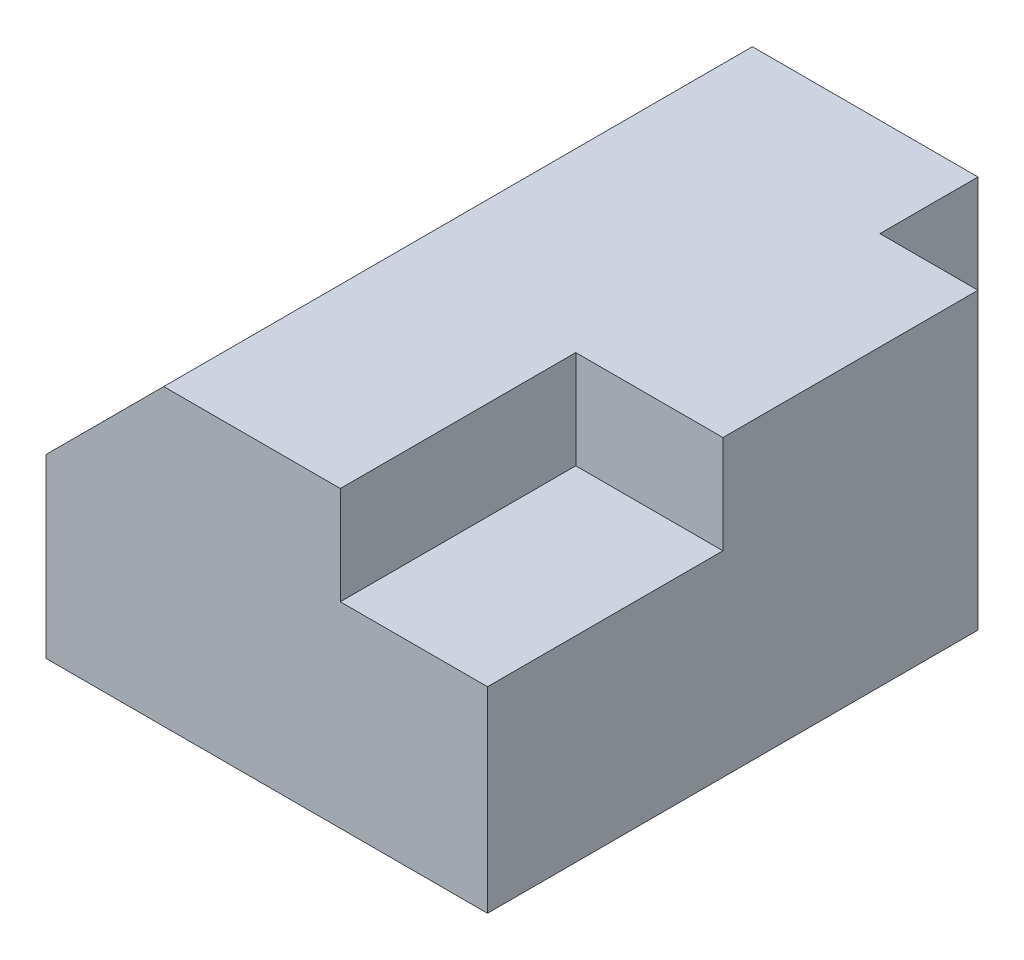
ISO-10303-21;
HEADER;
FILE_DESCRIPTION(('STEP AP214'),'2;1');
FILE_NAME('part.step','',(''),(''),'','','');
FILE_SCHEMA(('AUTOMOTIVE_DESIGN { 1 0 10303 214 1 1 1 1 }'));
ENDSEC;
DATA;
#1=APPLICATION_CONTEXT('core data for automotive mechanical design processes');
#2=APPLICATION_PROTOCOL_DEFINITION('international standard','automotive_design',2000,#1);
#3=PRODUCT_CONTEXT('',#1,'mechanical');
#4=PRODUCT('Part','Part','',(#3));
#5=PRODUCT_RELATED_PRODUCT_CATEGORY('part','',(#4));
#6=PRODUCT_DEFINITION_FORMATION('','',#4);
#7=PRODUCT_DEFINITION_CONTEXT('part definition',#1,'design');
#8=PRODUCT_DEFINITION('design','',#6,#7);
#9=PRODUCT_DEFINITION_SHAPE('','',#8);
#10=(LENGTH_UNIT() NAMED_UNIT(*) SI_UNIT(.MILLI.,.METRE.));
#11=(NAMED_UNIT(*) PLANE_ANGLE_UNIT() SI_UNIT($,.RADIAN.));
#12=(NAMED_UNIT(*) SI_UNIT($,.STERADIAN.) SOLID_ANGLE_UNIT());
#13=UNCERTAINTY_MEASURE_WITH_UNIT(LENGTH_MEASURE(1.E-05),#10,'distance_accuracy_value','');
#14=(GEOMETRIC_REPRESENTATION_CONTEXT(3) GLOBAL_UNCERTAINTY_ASSIGNED_CONTEXT((#13)) GLOBAL_UNIT_ASSIGNED_CONTEXT((#10,
#11,#12)) REPRESENTATION_CONTEXT('',''));
#15=CARTESIAN_POINT('',(0.,0.,0.));
#16=DIRECTION('',(0.,0.,1.));
#17=DIRECTION('',(1.,0.,0.));
#18=AXIS2_PLACEMENT_3D('',#15,#16,#17);
#19=CARTESIAN_POINT('',(22.9558011049724,15.6629834254144,60.));
#20=DIRECTION('',(0.,-1.,0.));
#21=DIRECTION('',(1.,0.,0.));
#22=AXIS2_PLACEMENT_3D('',#19,#20,#21);
#23=PLANE('',#22);
#24=DIRECTION('',(1.,0.,0.));
#25=VECTOR('',#24,1.);
#26=CARTESIAN_POINT('',(7.9558011049724,15.6629834254144,36.));
#27=LINE('',#26,#25);
#28=CARTESIAN_POINT('',(7.95580110497239,15.6629834254144,36.));
#29=VERTEX_POINT('',#28);
#30=CARTESIAN_POINT('',(22.9558011049724,15.6629834254144,36.));
#31=VERTEX_POINT('',#30);
#32=EDGE_CURVE('E208',#29,#31,#27,.T.);
#33=ORIENTED_EDGE('',*,*,#32,.F.);
#34=DIRECTION('',(0.,0.,-1.));
#35=VECTOR('',#34,1.);
#36=CARTESIAN_POINT('',(7.95580110497239,15.6629834254144,60.));
#37=LINE('',#36,#35);
#38=CARTESIAN_POINT('',(7.95580110497239,15.6629834254144,60.));
#39=VERTEX_POINT('',#38);
#40=EDGE_CURVE('E158',#39,#29,#37,.T.);
#41=ORIENTED_EDGE('',*,*,#40,.F.);
#42=DIRECTION('',(-1.,0.,0.));
#43=VECTOR('',#42,1.);
#44=CARTESIAN_POINT('',(22.9558011049724,15.6629834254144,60.));
#45=LINE('',#44,#43);
#46=CARTESIAN_POINT('',(22.9558011049724,15.6629834254144,60.));
#47=VERTEX_POINT('',#46);
#48=EDGE_CURVE('E193',#47,#39,#45,.T.);
#49=ORIENTED_EDGE('',*,*,#48,.F.);
#50=DIRECTION('',(0.,0.,-1.));
#51=VECTOR('',#50,1.);
#52=CARTESIAN_POINT('',(22.9558011049724,15.6629834254144,60.));
#53=LINE('',#52,#51);
#54=EDGE_CURVE('E62',#47,#31,#53,.T.);
#55=ORIENTED_EDGE('',*,*,#54,.T.);
#56=EDGE_LOOP('',(#33,#41,#49,#55));
#57=FACE_BOUND('',#56,.T.);
#58=ADVANCED_FACE('F39',(#57),#23,.F.);
#59=CARTESIAN_POINT('',(7.95580110497239,15.6629834254144,60.));
#60=DIRECTION('',(-1.,0.,0.));
#61=DIRECTION('',(0.,0.,1.));
#62=AXIS2_PLACEMENT_3D('',#59,#60,#61);
#63=PLANE('',#62);
#64=DIRECTION('',(0.,-1.,0.));
#65=VECTOR('',#64,1.);
#66=CARTESIAN_POINT('',(7.95580110497239,25.6629834254144,36.));
#67=LINE('',#66,#65);
#68=CARTESIAN_POINT('',(7.95580110497239,25.6629834254144,36.));
#69=VERTEX_POINT('',#68);
#70=EDGE_CURVE('E180',#69,#29,#67,.T.);
#71=ORIENTED_EDGE('',*,*,#70,.F.);
#72=DIRECTION('',(0.,0.,-1.));
#73=VECTOR('',#72,1.);
#74=CARTESIAN_POINT('',(7.95580110497239,25.6629834254144,60.));
#75=LINE('',#74,#73);
#76=CARTESIAN_POINT('',(7.95580110497239,25.6629834254144,60.));
#77=VERTEX_POINT('',#76);
#78=EDGE_CURVE('E153',#77,#69,#75,.T.);
#79=ORIENTED_EDGE('',*,*,#78,.F.);
#80=DIRECTION('',(0.,1.,0.));
#81=VECTOR('',#80,1.);
#82=CARTESIAN_POINT('',(7.95580110497239,15.6629834254144,60.));
#83=LINE('',#82,#81);
#84=EDGE_CURVE('E190',#39,#77,#83,.T.);
#85=ORIENTED_EDGE('',*,*,#84,.F.);
#86=ORIENTED_EDGE('',*,*,#40,.T.);
#87=EDGE_LOOP('',(#71,#79,#85,#86));
#88=FACE_BOUND('',#87,.T.);
#89=ADVANCED_FACE('F258',(#88),#63,.F.);
#90=CARTESIAN_POINT('',(-10.0441988950276,25.6629834254144,60.));
#91=DIRECTION('',(0.707106781186548,-0.707106781186547,0.));
#92=DIRECTION('',(0.707106781186547,0.707106781186548,0.));
#93=AXIS2_PLACEMENT_3D('',#90,#91,#92);
#94=PLANE('',#93);
#95=DIRECTION('',(-0.707106781186547,-0.707106781186548,0.));
#96=VECTOR('',#95,1.);
#97=CARTESIAN_POINT('',(-10.0441988950276,25.6629834254144,0.));
#98=LINE('',#97,#96);
#99=CARTESIAN_POINT('',(-10.0441988950276,25.6629834254144,0.));
#100=VERTEX_POINT('',#99);
#101=CARTESIAN_POINT('',(-22.0441988950276,13.6629834254144,0.));
#102=VERTEX_POINT('',#101);
#103=EDGE_CURVE('E136',#100,#102,#98,.T.);
#104=ORIENTED_EDGE('',*,*,#103,.T.);
#105=DIRECTION('',(0.,0.,-1.));
#106=VECTOR('',#105,1.);
#107=CARTESIAN_POINT('',(-22.0441988950276,13.6629834254144,60.));
#108=LINE('',#107,#106);
#109=CARTESIAN_POINT('',(-22.0441988950276,13.6629834254144,60.));
#110=VERTEX_POINT('',#109);
#111=EDGE_CURVE('E48',#110,#102,#108,.T.);
#112=ORIENTED_EDGE('',*,*,#111,.F.);
#113=DIRECTION('',(-0.707106781186547,-0.707106781186548,0.));
#114=VECTOR('',#113,1.);
#115=CARTESIAN_POINT('',(-10.0441988950276,25.6629834254144,60.));
#116=LINE('',#115,#114);
#117=CARTESIAN_POINT('',(-10.0441988950276,25.6629834254144,60.));
#118=VERTEX_POINT('',#117);
#119=EDGE_CURVE('E138',#118,#110,#116,.T.);
#120=ORIENTED_EDGE('',*,*,#119,.F.);
#121=DIRECTION('',(0.,0.,-1.));
#122=VECTOR('',#121,1.);
#123=CARTESIAN_POINT('',(-10.0441988950276,25.6629834254144,60.));
#124=LINE('',#123,#122);
#125=EDGE_CURVE('E150',#118,#100,#124,.T.);
#126=ORIENTED_EDGE('',*,*,#125,.T.);
#127=EDGE_LOOP('',(#104,#112,#120,#126));
#128=FACE_BOUND('',#127,.T.);
#129=ADVANCED_FACE('F41',(#128),#94,.F.);
#130=CARTESIAN_POINT('',(-22.0441988950276,13.6629834254144,60.));
#131=DIRECTION('',(1.,0.,0.));
#132=DIRECTION('',(0.,1.,0.));
#133=AXIS2_PLACEMENT_3D('',#130,#131,#132);
#134=PLANE('',#133);
#135=DIRECTION('',(0.,-1.,0.));
#136=VECTOR('',#135,1.);
#137=CARTESIAN_POINT('',(-22.0441988950276,13.6629834254144,0.));
#138=LINE('',#137,#136);
#139=CARTESIAN_POINT('',(-22.0441988950276,-4.33701657458564,0.));
#140=VERTEX_POINT('',#139);
#141=EDGE_CURVE('E146',#102,#140,#138,.T.);
#142=ORIENTED_EDGE('',*,*,#141,.T.);
#143=DIRECTION('',(0.,0.,-1.));
#144=VECTOR('',#143,1.);
#145=CARTESIAN_POINT('',(-22.0441988950276,-4.33701657458564,60.));
#146=LINE('',#145,#144);
#147=CARTESIAN_POINT('',(-22.0441988950276,-4.33701657458564,60.));
#148=VERTEX_POINT('',#147);
#149=EDGE_CURVE('E168',#148,#140,#146,.T.);
#150=ORIENTED_EDGE('',*,*,#149,.F.);
#151=DIRECTION('',(0.,-1.,0.));
#152=VECTOR('',#151,1.);
#153=CARTESIAN_POINT('',(-22.0441988950276,13.6629834254144,60.));
#154=LINE('',#153,#152);
#155=EDGE_CURVE('E144',#110,#148,#154,.T.);
#156=ORIENTED_EDGE('',*,*,#155,.F.);
#157=ORIENTED_EDGE('',*,*,#111,.T.);
#158=EDGE_LOOP('',(#142,#150,#156,#157));
#159=FACE_BOUND('',#158,.T.);
#160=ADVANCED_FACE('F175',(#159),#134,.F.);
#161=CARTESIAN_POINT('',(-22.0441988950276,-4.33701657458564,60.));
#162=DIRECTION('',(0.,1.,0.));
#163=DIRECTION('',(0.,0.,1.));
#164=AXIS2_PLACEMENT_3D('',#161,#162,#163);
#165=PLANE('',#164);
#166=DIRECTION('',(0.,0.,1.));
#167=VECTOR('',#166,1.);
#168=CARTESIAN_POINT('',(12.9558011049724,-4.33701657458564,60.));
#169=LINE('',#168,#167);
#170=CARTESIAN_POINT('',(12.9558011049724,-4.33701657458564,0.));
#171=VERTEX_POINT('',#170);
#172=CARTESIAN_POINT('',(12.9558011049724,-4.33701657458564,10.));
#173=VERTEX_POINT('',#172);
#174=EDGE_CURVE('E55',#171,#173,#169,.T.);
#175=ORIENTED_EDGE('',*,*,#174,.T.);
#176=DIRECTION('',(1.,0.,0.));
#177=VECTOR('',#176,1.);
#178=CARTESIAN_POINT('',(-22.0441988950276,-4.33701657458564,10.));
#179=LINE('',#178,#177);
#180=CARTESIAN_POINT('',(22.9558011049724,-4.33701657458564,10.));
#181=VERTEX_POINT('',#180);
#182=EDGE_CURVE('E212',#173,#181,#179,.T.);
#183=ORIENTED_EDGE('',*,*,#182,.T.);
#184=DIRECTION('',(0.,0.,-1.));
#185=VECTOR('',#184,1.);
#186=CARTESIAN_POINT('',(22.9558011049724,-4.33701657458564,60.));
#187=LINE('',#186,#185);
#188=CARTESIAN_POINT('',(22.9558011049724,-4.33701657458564,60.));
#189=VERTEX_POINT('',#188);
#190=EDGE_CURVE('E164',#189,#181,#187,.T.);
#191=ORIENTED_EDGE('',*,*,#190,.F.);
#192=DIRECTION('',(1.,0.,0.));
#193=VECTOR('',#192,1.);
#194=CARTESIAN_POINT('',(-22.0441988950276,-4.33701657458564,60.));
#195=LINE('',#194,#193);
#196=EDGE_CURVE('E199',#148,#189,#195,.T.);
#197=ORIENTED_EDGE('',*,*,#196,.F.);
#198=ORIENTED_EDGE('',*,*,#149,.T.);
#199=DIRECTION('',(1.,0.,0.));
#200=VECTOR('',#199,1.);
#201=CARTESIAN_POINT('',(-22.0441988950276,-4.33701657458564,0.));
#202=LINE('',#201,#200);
#203=EDGE_CURVE('E139',#140,#171,#202,.T.);
#204=ORIENTED_EDGE('',*,*,#203,.T.);
#205=EDGE_LOOP('',(#175,#183,#191,#197,#198,#204));
#206=FACE_BOUND('',#205,.T.);
#207=ADVANCED_FACE('F249',(#206),#165,.F.);
#208=CARTESIAN_POINT('',(22.9558011049724,-4.33701657458564,60.));
#209=DIRECTION('',(-1.,0.,0.));
#210=DIRECTION('',(0.,0.,1.));
#211=AXIS2_PLACEMENT_3D('',#208,#209,#210);
#212=PLANE('',#211);
#213=ORIENTED_EDGE('',*,*,#190,.T.);
#214=DIRECTION('',(0.,1.,0.));
#215=VECTOR('',#214,1.);
#216=CARTESIAN_POINT('',(22.9558011049724,-14.3370165745857,10.));
#217=LINE('',#216,#215);
#218=CARTESIAN_POINT('',(22.9558011049724,25.6629834254144,10.));
#219=VERTEX_POINT('',#218);
#220=EDGE_CURVE('E222',#181,#219,#217,.T.);
#221=ORIENTED_EDGE('',*,*,#220,.T.);
#222=DIRECTION('',(0.,0.,-1.));
#223=VECTOR('',#222,1.);
#224=CARTESIAN_POINT('',(22.9558011049724,25.6629834254144,36.));
#225=LINE('',#224,#223);
#226=CARTESIAN_POINT('',(22.9558011049724,25.6629834254144,36.));
#227=VERTEX_POINT('',#226);
#228=EDGE_CURVE('E211',#227,#219,#225,.T.);
#229=ORIENTED_EDGE('',*,*,#228,.F.);
#230=DIRECTION('',(0.,-1.,0.));
#231=VECTOR('',#230,1.);
#232=CARTESIAN_POINT('',(22.9558011049724,25.6629834254144,36.));
#233=LINE('',#232,#231);
#234=EDGE_CURVE('E185',#227,#31,#233,.T.);
#235=ORIENTED_EDGE('',*,*,#234,.T.);
#236=ORIENTED_EDGE('',*,*,#54,.F.);
#237=DIRECTION('',(0.,1.,0.));
#238=VECTOR('',#237,1.);
#239=CARTESIAN_POINT('',(22.9558011049724,-4.33701657458564,60.));
#240=LINE('',#239,#238);
#241=EDGE_CURVE('E196',#189,#47,#240,.T.);
#242=ORIENTED_EDGE('',*,*,#241,.F.);
#243=EDGE_LOOP('',(#213,#221,#229,#235,#236,#242));
#244=FACE_BOUND('',#243,.T.);
#245=ADVANCED_FACE('F234',(#244),#212,.F.);
#246=CARTESIAN_POINT('',(7.95580110497239,25.6629834254144,60.));
#247=DIRECTION('',(0.,-1.,0.));
#248=DIRECTION('',(0.,0.,-1.));
#249=AXIS2_PLACEMENT_3D('',#246,#247,#248);
#250=PLANE('',#249);
#251=ORIENTED_EDGE('',*,*,#228,.T.);
#252=DIRECTION('',(1.,0.,0.));
#253=VECTOR('',#252,1.);
#254=CARTESIAN_POINT('',(12.9558011049724,25.6629834254144,10.));
#255=LINE('',#254,#253);
#256=CARTESIAN_POINT('',(12.9558011049724,25.6629834254144,10.));
#257=VERTEX_POINT('',#256);
#258=EDGE_CURVE('E130',#257,#219,#255,.T.);
#259=ORIENTED_EDGE('',*,*,#258,.F.);
#260=DIRECTION('',(0.,0.,1.));
#261=VECTOR('',#260,1.);
#262=CARTESIAN_POINT('',(12.9558011049724,25.6629834254144,0.));
#263=LINE('',#262,#261);
#264=CARTESIAN_POINT('',(12.9558011049724,25.6629834254144,0.));
#265=VERTEX_POINT('',#264);
#266=EDGE_CURVE('E118',#265,#257,#263,.T.);
#267=ORIENTED_EDGE('',*,*,#266,.F.);
#268=DIRECTION('',(-1.,0.,0.));
#269=VECTOR('',#268,1.);
#270=CARTESIAN_POINT('',(7.95580110497239,25.6629834254144,0.));
#271=LINE('',#270,#269);
#272=EDGE_CURVE('E128',#265,#100,#271,.T.);
#273=ORIENTED_EDGE('',*,*,#272,.T.);
#274=ORIENTED_EDGE('',*,*,#125,.F.);
#275=DIRECTION('',(-1.,0.,0.));
#276=VECTOR('',#275,1.);
#277=CARTESIAN_POINT('',(7.95580110497239,25.6629834254144,60.));
#278=LINE('',#277,#276);
#279=EDGE_CURVE('E154',#77,#118,#278,.T.);
#280=ORIENTED_EDGE('',*,*,#279,.F.);
#281=ORIENTED_EDGE('',*,*,#78,.T.);
#282=DIRECTION('',(1.,0.,0.));
#283=VECTOR('',#282,1.);
#284=CARTESIAN_POINT('',(7.95580110497239,25.6629834254144,36.));
#285=LINE('',#284,#283);
#286=EDGE_CURVE('E207',#69,#227,#285,.T.);
#287=ORIENTED_EDGE('',*,*,#286,.T.);
#288=EDGE_LOOP('',(#251,#259,#267,#273,#274,#280,#281,#287));
#289=FACE_BOUND('',#288,.T.);
#290=ADVANCED_FACE('F126',(#289),#250,.F.);
#291=CARTESIAN_POINT('',(0.,0.,60.));
#292=DIRECTION('',(0.,0.,1.));
#293=DIRECTION('',(1.,0.,0.));
#294=AXIS2_PLACEMENT_3D('',#291,#292,#293);
#295=PLANE('',#294);
#296=ORIENTED_EDGE('',*,*,#119,.T.);
#297=ORIENTED_EDGE('',*,*,#155,.T.);
#298=ORIENTED_EDGE('',*,*,#196,.T.);
#299=ORIENTED_EDGE('',*,*,#241,.T.);
#300=ORIENTED_EDGE('',*,*,#48,.T.);
#301=ORIENTED_EDGE('',*,*,#84,.T.);
#302=ORIENTED_EDGE('',*,*,#279,.T.);
#303=EDGE_LOOP('',(#296,#297,#298,#299,#300,#301,#302));
#304=FACE_BOUND('',#303,.T.);
#305=ADVANCED_FACE('F246',(#304),#295,.T.);
#306=CARTESIAN_POINT('',(0.,0.,0.));
#307=DIRECTION('',(0.,0.,1.));
#308=DIRECTION('',(1.,0.,0.));
#309=AXIS2_PLACEMENT_3D('',#306,#307,#308);
#310=PLANE('',#309);
#311=ORIENTED_EDGE('',*,*,#272,.F.);
#312=DIRECTION('',(0.,-1.,0.));
#313=VECTOR('',#312,1.);
#314=CARTESIAN_POINT('',(12.9558011049724,0.,0.));
#315=LINE('',#314,#313);
#316=EDGE_CURVE('E11',#265,#171,#315,.T.);
#317=ORIENTED_EDGE('',*,*,#316,.T.);
#318=ORIENTED_EDGE('',*,*,#203,.F.);
#319=ORIENTED_EDGE('',*,*,#141,.F.);
#320=ORIENTED_EDGE('',*,*,#103,.F.);
#321=EDGE_LOOP('',(#311,#317,#318,#319,#320));
#322=FACE_BOUND('',#321,.T.);
#323=ADVANCED_FACE('F134',(#322),#310,.F.);
#324=CARTESIAN_POINT('',(7.95580110497239,25.6629834254144,36.));
#325=DIRECTION('',(0.,0.,-1.));
#326=DIRECTION('',(-1.,0.,0.));
#327=AXIS2_PLACEMENT_3D('',#324,#325,#326);
#328=PLANE('',#327);
#329=ORIENTED_EDGE('',*,*,#32,.T.);
#330=ORIENTED_EDGE('',*,*,#234,.F.);
#331=ORIENTED_EDGE('',*,*,#286,.F.);
#332=ORIENTED_EDGE('',*,*,#70,.T.);
#333=EDGE_LOOP('',(#329,#330,#331,#332));
#334=FACE_BOUND('',#333,.T.);
#335=ADVANCED_FACE('F242',(#334),#328,.F.);
#336=CARTESIAN_POINT('',(12.9558011049724,-14.3370165745857,10.));
#337=DIRECTION('',(0.,0.,1.));
#338=DIRECTION('',(1.,0.,0.));
#339=AXIS2_PLACEMENT_3D('',#336,#337,#338);
#340=PLANE('',#339);
#341=DIRECTION('',(0.,1.,0.));
#342=VECTOR('',#341,1.);
#343=CARTESIAN_POINT('',(12.9558011049724,-14.3370165745857,10.));
#344=LINE('',#343,#342);
#345=EDGE_CURVE('E223',#173,#257,#344,.T.);
#346=ORIENTED_EDGE('',*,*,#345,.T.);
#347=ORIENTED_EDGE('',*,*,#258,.T.);
#348=ORIENTED_EDGE('',*,*,#220,.F.);
#349=ORIENTED_EDGE('',*,*,#182,.F.);
#350=EDGE_LOOP('',(#346,#347,#348,#349));
#351=FACE_BOUND('',#350,.T.);
#352=ADVANCED_FACE('F231',(#351),#340,.F.);
#353=CARTESIAN_POINT('',(12.9558011049724,-14.3370165745857,0.));
#354=DIRECTION('',(-1.,0.,0.));
#355=DIRECTION('',(0.,0.,1.));
#356=AXIS2_PLACEMENT_3D('',#353,#354,#355);
#357=PLANE('',#356);
#358=ORIENTED_EDGE('',*,*,#316,.F.);
#359=ORIENTED_EDGE('',*,*,#266,.T.);
#360=ORIENTED_EDGE('',*,*,#345,.F.);
#361=ORIENTED_EDGE('',*,*,#174,.F.);
#362=EDGE_LOOP('',(#358,#359,#360,#361));
#363=FACE_BOUND('',#362,.T.);
#364=ADVANCED_FACE('F117',(#363),#357,.F.);
#365=CLOSED_SHELL('',(#58,#89,#129,#160,#207,#245,#290,#305,#323,#335,#352,#364));
#366=MANIFOLD_SOLID_BREP('B2',#365);
#367=ADVANCED_BREP_SHAPE_REPRESENTATION('',(#18,#366),#14);
#368=SHAPE_DEFINITION_REPRESENTATION(#9,#367);
ENDSEC;
END-ISO-10303-21;
